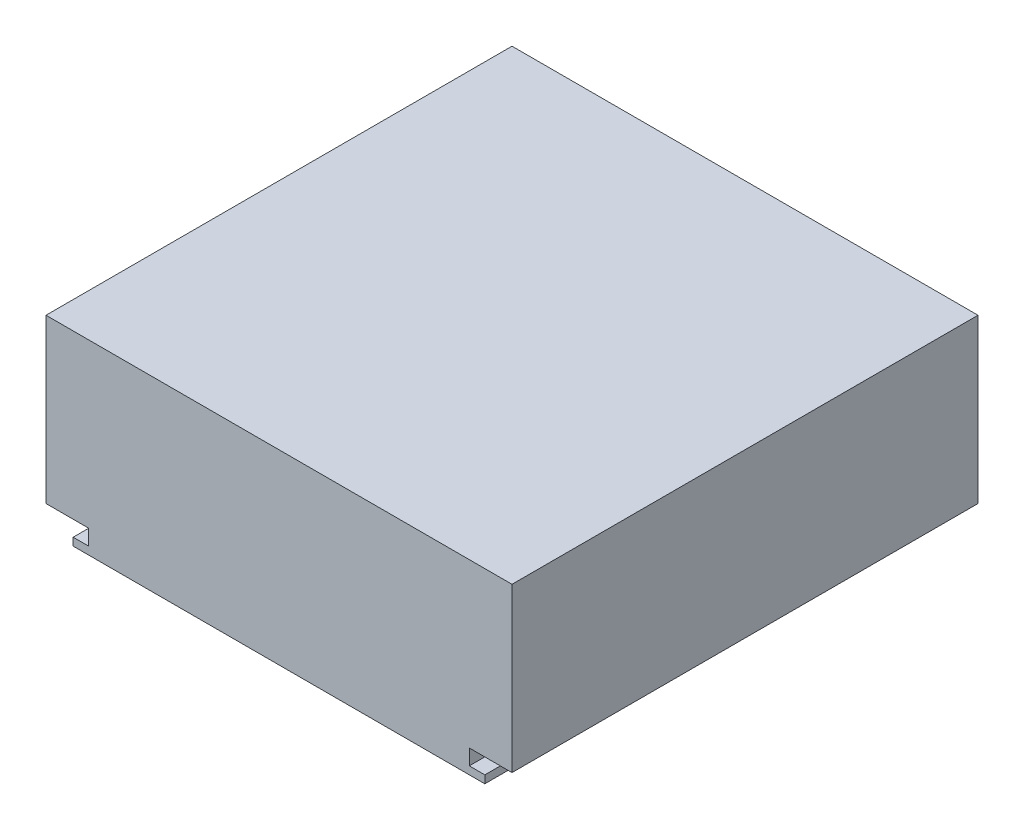
ISO-10303-21;
HEADER;
FILE_DESCRIPTION(('STEP AP214'),'2;1');
FILE_NAME('part.step','',(''),(''),'','','');
FILE_SCHEMA(('AUTOMOTIVE_DESIGN { 1 0 10303 214 1 1 1 1 }'));
ENDSEC;
DATA;
#1=APPLICATION_CONTEXT('core data for automotive mechanical design processes');
#2=APPLICATION_PROTOCOL_DEFINITION('international standard','automotive_design',2000,#1);
#3=PRODUCT_CONTEXT('',#1,'mechanical');
#4=PRODUCT('Part','Part','',(#3));
#5=PRODUCT_RELATED_PRODUCT_CATEGORY('part','',(#4));
#6=PRODUCT_DEFINITION_FORMATION('','',#4);
#7=PRODUCT_DEFINITION_CONTEXT('part definition',#1,'design');
#8=PRODUCT_DEFINITION('design','',#6,#7);
#9=PRODUCT_DEFINITION_SHAPE('','',#8);
#10=(LENGTH_UNIT() NAMED_UNIT(*) SI_UNIT(.MILLI.,.METRE.));
#11=(NAMED_UNIT(*) PLANE_ANGLE_UNIT() SI_UNIT($,.RADIAN.));
#12=(NAMED_UNIT(*) SI_UNIT($,.STERADIAN.) SOLID_ANGLE_UNIT());
#13=UNCERTAINTY_MEASURE_WITH_UNIT(LENGTH_MEASURE(1.E-05),#10,'distance_accuracy_value','');
#14=(GEOMETRIC_REPRESENTATION_CONTEXT(3) GLOBAL_UNCERTAINTY_ASSIGNED_CONTEXT((#13)) GLOBAL_UNIT_ASSIGNED_CONTEXT((#10,
#11,#12)) REPRESENTATION_CONTEXT('',''));
#15=CARTESIAN_POINT('',(0.,0.,0.));
#16=DIRECTION('',(0.,0.,1.));
#17=DIRECTION('',(1.,0.,0.));
#18=AXIS2_PLACEMENT_3D('',#15,#16,#17);
#19=CARTESIAN_POINT('',(0.,0.,-30.));
#20=DIRECTION('',(0.,0.,1.));
#21=DIRECTION('',(1.,0.,0.));
#22=AXIS2_PLACEMENT_3D('',#19,#20,#21);
#23=PLANE('',#22);
#24=DIRECTION('',(0.,-1.,0.));
#25=VECTOR('',#24,1.);
#26=CARTESIAN_POINT('',(7.175,24.,-30.));
#27=LINE('',#26,#25);
#28=CARTESIAN_POINT('',(7.175,24.,-30.));
#29=VERTEX_POINT('',#28);
#30=CARTESIAN_POINT('',(7.175,0.,-30.));
#31=VERTEX_POINT('',#30);
#32=EDGE_CURVE('E165',#29,#31,#27,.T.);
#33=ORIENTED_EDGE('',*,*,#32,.F.);
#34=DIRECTION('',(-1.,0.,0.));
#35=VECTOR('',#34,1.);
#36=CARTESIAN_POINT('',(-30.,24.,-30.));
#37=LINE('',#36,#35);
#38=CARTESIAN_POINT('',(30.,24.,-30.));
#39=VERTEX_POINT('',#38);
#40=EDGE_CURVE('E199',#39,#29,#37,.T.);
#41=ORIENTED_EDGE('',*,*,#40,.F.);
#42=DIRECTION('',(0.,1.,0.));
#43=VECTOR('',#42,1.);
#44=CARTESIAN_POINT('',(30.,24.,-30.));
#45=LINE('',#44,#43);
#46=CARTESIAN_POINT('',(30.,3.00000000000001,-30.));
#47=VERTEX_POINT('',#46);
#48=EDGE_CURVE('E260',#47,#39,#45,.T.);
#49=ORIENTED_EDGE('',*,*,#48,.F.);
#50=DIRECTION('',(1.,0.,0.));
#51=VECTOR('',#50,1.);
#52=CARTESIAN_POINT('',(30.,3.00000000000001,-30.));
#53=LINE('',#52,#51);
#54=CARTESIAN_POINT('',(24.5,3.00000000000001,-30.));
#55=VERTEX_POINT('',#54);
#56=EDGE_CURVE('E257',#55,#47,#53,.T.);
#57=ORIENTED_EDGE('',*,*,#56,.F.);
#58=DIRECTION('',(0.,1.,0.));
#59=VECTOR('',#58,1.);
#60=CARTESIAN_POINT('',(24.5,3.00000000000001,-30.));
#61=LINE('',#60,#59);
#62=CARTESIAN_POINT('',(24.5,1.00000000000001,-30.));
#63=VERTEX_POINT('',#62);
#64=EDGE_CURVE('E254',#63,#55,#61,.T.);
#65=ORIENTED_EDGE('',*,*,#64,.F.);
#66=DIRECTION('',(-1.,0.,0.));
#67=VECTOR('',#66,1.);
#68=CARTESIAN_POINT('',(26.5,1.00000000000001,-30.));
#69=LINE('',#68,#67);
#70=CARTESIAN_POINT('',(26.5,1.00000000000001,-30.));
#71=VERTEX_POINT('',#70);
#72=EDGE_CURVE('E251',#71,#63,#69,.T.);
#73=ORIENTED_EDGE('',*,*,#72,.F.);
#74=DIRECTION('',(0.,1.,0.));
#75=VECTOR('',#74,1.);
#76=CARTESIAN_POINT('',(26.5,1.00000000000001,-30.));
#77=LINE('',#76,#75);
#78=CARTESIAN_POINT('',(26.5,0.,-30.));
#79=VERTEX_POINT('',#78);
#80=EDGE_CURVE('E248',#79,#71,#77,.T.);
#81=ORIENTED_EDGE('',*,*,#80,.F.);
#82=DIRECTION('',(1.,0.,0.));
#83=VECTOR('',#82,1.);
#84=CARTESIAN_POINT('',(-26.5,0.,-30.));
#85=LINE('',#84,#83);
#86=EDGE_CURVE('E244',#31,#79,#85,.T.);
#87=ORIENTED_EDGE('',*,*,#86,.F.);
#88=EDGE_LOOP('',(#33,#41,#49,#57,#65,#73,#81,#87));
#89=FACE_BOUND('',#88,.T.);
#90=ADVANCED_FACE('F39',(#89),#23,.F.);
#91=CARTESIAN_POINT('',(-30.,24.,30.));
#92=DIRECTION('',(1.,0.,0.));
#93=DIRECTION('',(0.,0.,-1.));
#94=AXIS2_PLACEMENT_3D('',#91,#92,#93);
#95=PLANE('',#94);
#96=DIRECTION('',(0.,-1.,0.));
#97=VECTOR('',#96,1.);
#98=CARTESIAN_POINT('',(-30.,24.,-30.));
#99=LINE('',#98,#97);
#100=CARTESIAN_POINT('',(-30.,24.,-30.));
#101=VERTEX_POINT('',#100);
#102=CARTESIAN_POINT('',(-30.,3.,-30.));
#103=VERTEX_POINT('',#102);
#104=EDGE_CURVE('E183',#101,#103,#99,.T.);
#105=ORIENTED_EDGE('',*,*,#104,.T.);
#106=DIRECTION('',(0.,0.,-1.));
#107=VECTOR('',#106,1.);
#108=CARTESIAN_POINT('',(-30.,3.,30.));
#109=LINE('',#108,#107);
#110=CARTESIAN_POINT('',(-30.,3.,30.));
#111=VERTEX_POINT('',#110);
#112=EDGE_CURVE('E11',#111,#103,#109,.T.);
#113=ORIENTED_EDGE('',*,*,#112,.F.);
#114=DIRECTION('',(0.,-1.,0.));
#115=VECTOR('',#114,1.);
#116=CARTESIAN_POINT('',(-30.,24.,30.));
#117=LINE('',#116,#115);
#118=CARTESIAN_POINT('',(-30.,24.,30.));
#119=VERTEX_POINT('',#118);
#120=EDGE_CURVE('E194',#119,#111,#117,.T.);
#121=ORIENTED_EDGE('',*,*,#120,.F.);
#122=DIRECTION('',(0.,0.,-1.));
#123=VECTOR('',#122,1.);
#124=CARTESIAN_POINT('',(-30.,24.,30.));
#125=LINE('',#124,#123);
#126=EDGE_CURVE('E231',#119,#101,#125,.T.);
#127=ORIENTED_EDGE('',*,*,#126,.T.);
#128=EDGE_LOOP('',(#105,#113,#121,#127));
#129=FACE_BOUND('',#128,.T.);
#130=ADVANCED_FACE('F41',(#129),#95,.F.);
#131=CARTESIAN_POINT('',(-30.,3.,30.));
#132=DIRECTION('',(0.,1.,0.));
#133=DIRECTION('',(0.,0.,1.));
#134=AXIS2_PLACEMENT_3D('',#131,#132,#133);
#135=PLANE('',#134);
#136=DIRECTION('',(1.,0.,0.));
#137=VECTOR('',#136,1.);
#138=CARTESIAN_POINT('',(-30.,3.,-30.));
#139=LINE('',#138,#137);
#140=CARTESIAN_POINT('',(-24.5,3.,-30.));
#141=VERTEX_POINT('',#140);
#142=EDGE_CURVE('E188',#103,#141,#139,.T.);
#143=ORIENTED_EDGE('',*,*,#142,.T.);
#144=DIRECTION('',(0.,0.,-1.));
#145=VECTOR('',#144,1.);
#146=CARTESIAN_POINT('',(-24.5,3.,30.));
#147=LINE('',#146,#145);
#148=CARTESIAN_POINT('',(-24.5,3.,30.));
#149=VERTEX_POINT('',#148);
#150=EDGE_CURVE('E48',#149,#141,#147,.T.);
#151=ORIENTED_EDGE('',*,*,#150,.F.);
#152=DIRECTION('',(1.,0.,0.));
#153=VECTOR('',#152,1.);
#154=CARTESIAN_POINT('',(-30.,3.,30.));
#155=LINE('',#154,#153);
#156=EDGE_CURVE('E198',#111,#149,#155,.T.);
#157=ORIENTED_EDGE('',*,*,#156,.F.);
#158=ORIENTED_EDGE('',*,*,#112,.T.);
#159=EDGE_LOOP('',(#143,#151,#157,#158));
#160=FACE_BOUND('',#159,.T.);
#161=ADVANCED_FACE('F330',(#160),#135,.F.);
#162=CARTESIAN_POINT('',(-24.5,3.,30.));
#163=DIRECTION('',(1.,0.,0.));
#164=DIRECTION('',(0.,0.,-1.));
#165=AXIS2_PLACEMENT_3D('',#162,#163,#164);
#166=PLANE('',#165);
#167=DIRECTION('',(0.,-1.,0.));
#168=VECTOR('',#167,1.);
#169=CARTESIAN_POINT('',(-24.5,3.,-30.));
#170=LINE('',#169,#168);
#171=CARTESIAN_POINT('',(-24.5,1.,-30.));
#172=VERTEX_POINT('',#171);
#173=EDGE_CURVE('E235',#141,#172,#170,.T.);
#174=ORIENTED_EDGE('',*,*,#173,.T.);
#175=DIRECTION('',(0.,0.,-1.));
#176=VECTOR('',#175,1.);
#177=CARTESIAN_POINT('',(-24.5,1.,30.));
#178=LINE('',#177,#176);
#179=CARTESIAN_POINT('',(-24.5,1.,30.));
#180=VERTEX_POINT('',#179);
#181=EDGE_CURVE('E301',#180,#172,#178,.T.);
#182=ORIENTED_EDGE('',*,*,#181,.F.);
#183=DIRECTION('',(0.,-1.,0.));
#184=VECTOR('',#183,1.);
#185=CARTESIAN_POINT('',(-24.5,3.,30.));
#186=LINE('',#185,#184);
#187=EDGE_CURVE('E202',#149,#180,#186,.T.);
#188=ORIENTED_EDGE('',*,*,#187,.F.);
#189=ORIENTED_EDGE('',*,*,#150,.T.);
#190=EDGE_LOOP('',(#174,#182,#188,#189));
#191=FACE_BOUND('',#190,.T.);
#192=ADVANCED_FACE('F310',(#191),#166,.F.);
#193=CARTESIAN_POINT('',(-26.5,1.,30.));
#194=DIRECTION('',(0.,-1.,0.));
#195=DIRECTION('',(0.,0.,-1.));
#196=AXIS2_PLACEMENT_3D('',#193,#194,#195);
#197=PLANE('',#196);
#198=DIRECTION('',(-1.,0.,0.));
#199=VECTOR('',#198,1.);
#200=CARTESIAN_POINT('',(-26.5,1.,-30.));
#201=LINE('',#200,#199);
#202=CARTESIAN_POINT('',(-26.5,1.,-30.));
#203=VERTEX_POINT('',#202);
#204=EDGE_CURVE('E238',#172,#203,#201,.T.);
#205=ORIENTED_EDGE('',*,*,#204,.T.);
#206=DIRECTION('',(0.,0.,-1.));
#207=VECTOR('',#206,1.);
#208=CARTESIAN_POINT('',(-26.5,1.,30.));
#209=LINE('',#208,#207);
#210=CARTESIAN_POINT('',(-26.5,1.,30.));
#211=VERTEX_POINT('',#210);
#212=EDGE_CURVE('E297',#211,#203,#209,.T.);
#213=ORIENTED_EDGE('',*,*,#212,.F.);
#214=DIRECTION('',(-1.,0.,0.));
#215=VECTOR('',#214,1.);
#216=CARTESIAN_POINT('',(-26.5,1.,30.));
#217=LINE('',#216,#215);
#218=EDGE_CURVE('E205',#180,#211,#217,.T.);
#219=ORIENTED_EDGE('',*,*,#218,.F.);
#220=ORIENTED_EDGE('',*,*,#181,.T.);
#221=EDGE_LOOP('',(#205,#213,#219,#220));
#222=FACE_BOUND('',#221,.T.);
#223=ADVANCED_FACE('F318',(#222),#197,.F.);
#224=CARTESIAN_POINT('',(-26.5,1.,30.));
#225=DIRECTION('',(1.,0.,0.));
#226=DIRECTION('',(0.,0.,-1.));
#227=AXIS2_PLACEMENT_3D('',#224,#225,#226);
#228=PLANE('',#227);
#229=DIRECTION('',(0.,-1.,0.));
#230=VECTOR('',#229,1.);
#231=CARTESIAN_POINT('',(-26.5,1.,-30.));
#232=LINE('',#231,#230);
#233=CARTESIAN_POINT('',(-26.5,0.,-30.));
#234=VERTEX_POINT('',#233);
#235=EDGE_CURVE('E241',#203,#234,#232,.T.);
#236=ORIENTED_EDGE('',*,*,#235,.T.);
#237=DIRECTION('',(0.,0.,-1.));
#238=VECTOR('',#237,1.);
#239=CARTESIAN_POINT('',(-26.5,0.,30.));
#240=LINE('',#239,#238);
#241=CARTESIAN_POINT('',(-26.5,0.,30.));
#242=VERTEX_POINT('',#241);
#243=EDGE_CURVE('E293',#242,#234,#240,.T.);
#244=ORIENTED_EDGE('',*,*,#243,.F.);
#245=DIRECTION('',(0.,-1.,0.));
#246=VECTOR('',#245,1.);
#247=CARTESIAN_POINT('',(-26.5,1.,30.));
#248=LINE('',#247,#246);
#249=EDGE_CURVE('E208',#211,#242,#248,.T.);
#250=ORIENTED_EDGE('',*,*,#249,.F.);
#251=ORIENTED_EDGE('',*,*,#212,.T.);
#252=EDGE_LOOP('',(#236,#244,#250,#251));
#253=FACE_BOUND('',#252,.T.);
#254=ADVANCED_FACE('F322',(#253),#228,.F.);
#255=CARTESIAN_POINT('',(-26.5,0.,30.));
#256=DIRECTION('',(0.,1.,0.));
#257=DIRECTION('',(-1.,0.,0.));
#258=AXIS2_PLACEMENT_3D('',#255,#256,#257);
#259=PLANE('',#258);
#260=CARTESIAN_POINT('',(2.175,0.,-30.));
#261=VERTEX_POINT('',#260);
#262=EDGE_CURVE('E245',#234,#261,#85,.T.);
#263=ORIENTED_EDGE('',*,*,#262,.T.);
#264=DIRECTION('',(-1.,0.,0.));
#265=VECTOR('',#264,1.);
#266=CARTESIAN_POINT('',(7.175,0.,-30.));
#267=LINE('',#266,#265);
#268=EDGE_CURVE('E190',#31,#261,#267,.T.);
#269=ORIENTED_EDGE('',*,*,#268,.F.);
#270=ORIENTED_EDGE('',*,*,#86,.T.);
#271=DIRECTION('',(0.,0.,-1.));
#272=VECTOR('',#271,1.);
#273=CARTESIAN_POINT('',(26.5,0.,30.));
#274=LINE('',#273,#272);
#275=CARTESIAN_POINT('',(26.5,0.,30.));
#276=VERTEX_POINT('',#275);
#277=EDGE_CURVE('E289',#276,#79,#274,.T.);
#278=ORIENTED_EDGE('',*,*,#277,.F.);
#279=DIRECTION('',(1.,0.,0.));
#280=VECTOR('',#279,1.);
#281=CARTESIAN_POINT('',(-26.5,0.,30.));
#282=LINE('',#281,#280);
#283=EDGE_CURVE('E211',#242,#276,#282,.T.);
#284=ORIENTED_EDGE('',*,*,#283,.F.);
#285=ORIENTED_EDGE('',*,*,#243,.T.);
#286=EDGE_LOOP('',(#263,#269,#270,#278,#284,#285));
#287=FACE_BOUND('',#286,.T.);
#288=ADVANCED_FACE('F340',(#287),#259,.F.);
#289=CARTESIAN_POINT('',(26.5,1.00000000000001,30.));
#290=DIRECTION('',(-1.,0.,0.));
#291=DIRECTION('',(0.,0.,1.));
#292=AXIS2_PLACEMENT_3D('',#289,#290,#291);
#293=PLANE('',#292);
#294=ORIENTED_EDGE('',*,*,#80,.T.);
#295=DIRECTION('',(0.,0.,-1.));
#296=VECTOR('',#295,1.);
#297=CARTESIAN_POINT('',(26.5,1.00000000000001,30.));
#298=LINE('',#297,#296);
#299=CARTESIAN_POINT('',(26.5,1.00000000000001,30.));
#300=VERTEX_POINT('',#299);
#301=EDGE_CURVE('E285',#300,#71,#298,.T.);
#302=ORIENTED_EDGE('',*,*,#301,.F.);
#303=DIRECTION('',(0.,1.,0.));
#304=VECTOR('',#303,1.);
#305=CARTESIAN_POINT('',(26.5,1.00000000000001,30.));
#306=LINE('',#305,#304);
#307=EDGE_CURVE('E214',#276,#300,#306,.T.);
#308=ORIENTED_EDGE('',*,*,#307,.F.);
#309=ORIENTED_EDGE('',*,*,#277,.T.);
#310=EDGE_LOOP('',(#294,#302,#308,#309));
#311=FACE_BOUND('',#310,.T.);
#312=ADVANCED_FACE('F346',(#311),#293,.F.);
#313=CARTESIAN_POINT('',(26.5,1.00000000000001,30.));
#314=DIRECTION('',(0.,-1.,0.));
#315=DIRECTION('',(1.,0.,0.));
#316=AXIS2_PLACEMENT_3D('',#313,#314,#315);
#317=PLANE('',#316);
#318=ORIENTED_EDGE('',*,*,#72,.T.);
#319=DIRECTION('',(0.,0.,-1.));
#320=VECTOR('',#319,1.);
#321=CARTESIAN_POINT('',(24.5,1.00000000000001,30.));
#322=LINE('',#321,#320);
#323=CARTESIAN_POINT('',(24.5,1.00000000000001,30.));
#324=VERTEX_POINT('',#323);
#325=EDGE_CURVE('E281',#324,#63,#322,.T.);
#326=ORIENTED_EDGE('',*,*,#325,.F.);
#327=DIRECTION('',(-1.,0.,0.));
#328=VECTOR('',#327,1.);
#329=CARTESIAN_POINT('',(26.5,1.00000000000001,30.));
#330=LINE('',#329,#328);
#331=EDGE_CURVE('E217',#300,#324,#330,.T.);
#332=ORIENTED_EDGE('',*,*,#331,.F.);
#333=ORIENTED_EDGE('',*,*,#301,.T.);
#334=EDGE_LOOP('',(#318,#326,#332,#333));
#335=FACE_BOUND('',#334,.T.);
#336=ADVANCED_FACE('F353',(#335),#317,.F.);
#337=CARTESIAN_POINT('',(24.5,3.00000000000001,30.));
#338=DIRECTION('',(-1.,0.,0.));
#339=DIRECTION('',(0.,0.,1.));
#340=AXIS2_PLACEMENT_3D('',#337,#338,#339);
#341=PLANE('',#340);
#342=ORIENTED_EDGE('',*,*,#64,.T.);
#343=DIRECTION('',(0.,0.,-1.));
#344=VECTOR('',#343,1.);
#345=CARTESIAN_POINT('',(24.5,3.00000000000001,30.));
#346=LINE('',#345,#344);
#347=CARTESIAN_POINT('',(24.5,3.00000000000001,30.));
#348=VERTEX_POINT('',#347);
#349=EDGE_CURVE('E277',#348,#55,#346,.T.);
#350=ORIENTED_EDGE('',*,*,#349,.F.);
#351=DIRECTION('',(0.,1.,0.));
#352=VECTOR('',#351,1.);
#353=CARTESIAN_POINT('',(24.5,3.00000000000001,30.));
#354=LINE('',#353,#352);
#355=EDGE_CURVE('E220',#324,#348,#354,.T.);
#356=ORIENTED_EDGE('',*,*,#355,.F.);
#357=ORIENTED_EDGE('',*,*,#325,.T.);
#358=EDGE_LOOP('',(#342,#350,#356,#357));
#359=FACE_BOUND('',#358,.T.);
#360=ADVANCED_FACE('F357',(#359),#341,.F.);
#361=CARTESIAN_POINT('',(30.,3.00000000000001,30.));
#362=DIRECTION('',(0.,1.,0.));
#363=DIRECTION('',(-1.,0.,0.));
#364=AXIS2_PLACEMENT_3D('',#361,#362,#363);
#365=PLANE('',#364);
#366=ORIENTED_EDGE('',*,*,#56,.T.);
#367=DIRECTION('',(0.,0.,-1.));
#368=VECTOR('',#367,1.);
#369=CARTESIAN_POINT('',(30.,3.00000000000001,30.));
#370=LINE('',#369,#368);
#371=CARTESIAN_POINT('',(30.,3.00000000000001,30.));
#372=VERTEX_POINT('',#371);
#373=EDGE_CURVE('E273',#372,#47,#370,.T.);
#374=ORIENTED_EDGE('',*,*,#373,.F.);
#375=DIRECTION('',(1.,0.,0.));
#376=VECTOR('',#375,1.);
#377=CARTESIAN_POINT('',(30.,3.00000000000001,30.));
#378=LINE('',#377,#376);
#379=EDGE_CURVE('E223',#348,#372,#378,.T.);
#380=ORIENTED_EDGE('',*,*,#379,.F.);
#381=ORIENTED_EDGE('',*,*,#349,.T.);
#382=EDGE_LOOP('',(#366,#374,#380,#381));
#383=FACE_BOUND('',#382,.T.);
#384=ADVANCED_FACE('F364',(#383),#365,.F.);
#385=CARTESIAN_POINT('',(30.,24.,30.));
#386=DIRECTION('',(-1.,0.,0.));
#387=DIRECTION('',(0.,0.,1.));
#388=AXIS2_PLACEMENT_3D('',#385,#386,#387);
#389=PLANE('',#388);
#390=ORIENTED_EDGE('',*,*,#48,.T.);
#391=DIRECTION('',(0.,0.,-1.));
#392=VECTOR('',#391,1.);
#393=CARTESIAN_POINT('',(30.,24.,30.));
#394=LINE('',#393,#392);
#395=CARTESIAN_POINT('',(30.,24.,30.));
#396=VERTEX_POINT('',#395);
#397=EDGE_CURVE('E269',#396,#39,#394,.T.);
#398=ORIENTED_EDGE('',*,*,#397,.F.);
#399=DIRECTION('',(0.,1.,0.));
#400=VECTOR('',#399,1.);
#401=CARTESIAN_POINT('',(30.,24.,30.));
#402=LINE('',#401,#400);
#403=EDGE_CURVE('E226',#372,#396,#402,.T.);
#404=ORIENTED_EDGE('',*,*,#403,.F.);
#405=ORIENTED_EDGE('',*,*,#373,.T.);
#406=EDGE_LOOP('',(#390,#398,#404,#405));
#407=FACE_BOUND('',#406,.T.);
#408=ADVANCED_FACE('F367',(#407),#389,.F.);
#409=CARTESIAN_POINT('',(-30.,24.,30.));
#410=DIRECTION('',(0.,-1.,0.));
#411=DIRECTION('',(1.,0.,0.));
#412=AXIS2_PLACEMENT_3D('',#409,#410,#411);
#413=PLANE('',#412);
#414=ORIENTED_EDGE('',*,*,#40,.T.);
#415=DIRECTION('',(-1.,0.,0.));
#416=VECTOR('',#415,1.);
#417=CARTESIAN_POINT('',(7.175,24.,-30.));
#418=LINE('',#417,#416);
#419=CARTESIAN_POINT('',(2.175,24.,-30.));
#420=VERTEX_POINT('',#419);
#421=EDGE_CURVE('E161',#29,#420,#418,.T.);
#422=ORIENTED_EDGE('',*,*,#421,.T.);
#423=EDGE_CURVE('E60',#420,#101,#37,.T.);
#424=ORIENTED_EDGE('',*,*,#423,.T.);
#425=ORIENTED_EDGE('',*,*,#126,.F.);
#426=DIRECTION('',(-1.,0.,0.));
#427=VECTOR('',#426,1.);
#428=CARTESIAN_POINT('',(-30.,24.,30.));
#429=LINE('',#428,#427);
#430=EDGE_CURVE('E229',#396,#119,#429,.T.);
#431=ORIENTED_EDGE('',*,*,#430,.F.);
#432=ORIENTED_EDGE('',*,*,#397,.T.);
#433=EDGE_LOOP('',(#414,#422,#424,#425,#431,#432));
#434=FACE_BOUND('',#433,.T.);
#435=ADVANCED_FACE('F335',(#434),#413,.F.);
#436=CARTESIAN_POINT('',(0.,0.,30.));
#437=DIRECTION('',(0.,0.,1.));
#438=DIRECTION('',(1.,0.,0.));
#439=AXIS2_PLACEMENT_3D('',#436,#437,#438);
#440=PLANE('',#439);
#441=ORIENTED_EDGE('',*,*,#120,.T.);
#442=ORIENTED_EDGE('',*,*,#156,.T.);
#443=ORIENTED_EDGE('',*,*,#187,.T.);
#444=ORIENTED_EDGE('',*,*,#218,.T.);
#445=ORIENTED_EDGE('',*,*,#249,.T.);
#446=ORIENTED_EDGE('',*,*,#283,.T.);
#447=ORIENTED_EDGE('',*,*,#307,.T.);
#448=ORIENTED_EDGE('',*,*,#331,.T.);
#449=ORIENTED_EDGE('',*,*,#355,.T.);
#450=ORIENTED_EDGE('',*,*,#379,.T.);
#451=ORIENTED_EDGE('',*,*,#403,.T.);
#452=ORIENTED_EDGE('',*,*,#430,.T.);
#453=EDGE_LOOP('',(#441,#442,#443,#444,#445,#446,#447,#448,#449,#450,#451,#452));
#454=FACE_BOUND('',#453,.T.);
#455=ADVANCED_FACE('F326',(#454),#440,.T.);
#456=ORIENTED_EDGE('',*,*,#423,.F.);
#457=DIRECTION('',(0.,-1.,0.));
#458=VECTOR('',#457,1.);
#459=CARTESIAN_POINT('',(2.175,24.,-30.));
#460=LINE('',#459,#458);
#461=EDGE_CURVE('E55',#420,#261,#460,.T.);
#462=ORIENTED_EDGE('',*,*,#461,.T.);
#463=ORIENTED_EDGE('',*,*,#262,.F.);
#464=ORIENTED_EDGE('',*,*,#235,.F.);
#465=ORIENTED_EDGE('',*,*,#204,.F.);
#466=ORIENTED_EDGE('',*,*,#173,.F.);
#467=ORIENTED_EDGE('',*,*,#142,.F.);
#468=ORIENTED_EDGE('',*,*,#104,.F.);
#469=EDGE_LOOP('',(#456,#462,#463,#464,#465,#466,#467,#468));
#470=FACE_BOUND('',#469,.T.);
#471=ADVANCED_FACE('F314',(#470),#23,.F.);
#472=CARTESIAN_POINT('',(7.175,5.00000000000001,-35.));
#473=DIRECTION('',(-1.,0.,0.));
#474=DIRECTION('',(0.,0.,1.));
#475=AXIS2_PLACEMENT_3D('',#472,#473,#474);
#476=PLANE('',#475);
#477=CARTESIAN_POINT('',(7.175,5.00000000000001,-35.));
#478=DIRECTION('',(1.,0.,0.));
#479=DIRECTION('',(0.,0.,1.));
#480=AXIS2_PLACEMENT_3D('',#477,#478,#479);
#481=CIRCLE('',#480,3.05);
#482=CARTESIAN_POINT('',(7.175,2.12401493645718,-36.0154850635428));
#483=VERTEX_POINT('',#482);
#484=CARTESIAN_POINT('',(7.175,6.22468943443559,-37.7933198508552));
#485=VERTEX_POINT('',#484);
#486=EDGE_CURVE('E166',#483,#485,#481,.T.);
#487=ORIENTED_EDGE('',*,*,#486,.T.);
#488=DIRECTION('',(0.,0.915842574050893,0.401537519487077));
#489=VECTOR('',#488,1.);
#490=CARTESIAN_POINT('',(7.175,6.22468943443559,-37.7933198508552));
#491=LINE('',#490,#489);
#492=EDGE_CURVE('E154',#485,#29,#491,.T.);
#493=ORIENTED_EDGE('',*,*,#492,.T.);
#494=ORIENTED_EDGE('',*,*,#32,.T.);
#495=DIRECTION('',(0.,0.332945922473057,-0.942945922473057));
#496=VECTOR('',#495,1.);
#497=CARTESIAN_POINT('',(7.175,0.,-30.));
#498=LINE('',#497,#496);
#499=EDGE_CURVE('E172',#31,#483,#498,.T.);
#500=ORIENTED_EDGE('',*,*,#499,.T.);
#501=EDGE_LOOP('',(#487,#493,#494,#500));
#502=FACE_BOUND('',#501,.T.);
#503=CARTESIAN_POINT('',(7.175,5.00000000000001,-35.));
#504=DIRECTION('',(1.,0.,0.));
#505=DIRECTION('',(0.,0.,-1.));
#506=AXIS2_PLACEMENT_3D('',#503,#504,#505);
#507=CIRCLE('',#506,1.55);
#508=CARTESIAN_POINT('',(7.175,5.00000000000001,-36.55));
#509=VERTEX_POINT('',#508);
#510=EDGE_CURVE('E378',#509,#509,#507,.T.);
#511=ORIENTED_EDGE('',*,*,#510,.F.);
#512=EDGE_LOOP('',(#511));
#513=FACE_BOUND('',#512,.T.);
#514=ADVANCED_FACE('F169',(#502,#513),#476,.F.);
#515=CARTESIAN_POINT('',(2.175,5.00000000000001,-35.));
#516=DIRECTION('',(-1.,0.,0.));
#517=DIRECTION('',(0.,0.,1.));
#518=AXIS2_PLACEMENT_3D('',#515,#516,#517);
#519=PLANE('',#518);
#520=CARTESIAN_POINT('',(2.175,5.00000000000001,-35.));
#521=DIRECTION('',(1.,0.,0.));
#522=DIRECTION('',(0.,0.,1.));
#523=AXIS2_PLACEMENT_3D('',#520,#521,#522);
#524=CIRCLE('',#523,3.05);
#525=CARTESIAN_POINT('',(2.175,2.12401493645718,-36.0154850635428));
#526=VERTEX_POINT('',#525);
#527=CARTESIAN_POINT('',(2.175,6.22468943443559,-37.7933198508552));
#528=VERTEX_POINT('',#527);
#529=EDGE_CURVE('E181',#526,#528,#524,.T.);
#530=ORIENTED_EDGE('',*,*,#529,.F.);
#531=DIRECTION('',(0.,0.332945922473057,-0.942945922473057));
#532=VECTOR('',#531,1.);
#533=CARTESIAN_POINT('',(2.175,0.,-30.));
#534=LINE('',#533,#532);
#535=EDGE_CURVE('E177',#261,#526,#534,.T.);
#536=ORIENTED_EDGE('',*,*,#535,.F.);
#537=ORIENTED_EDGE('',*,*,#461,.F.);
#538=DIRECTION('',(0.,0.915842574050893,0.401537519487077));
#539=VECTOR('',#538,1.);
#540=CARTESIAN_POINT('',(2.175,6.22468943443559,-37.7933198508552));
#541=LINE('',#540,#539);
#542=EDGE_CURVE('E377',#528,#420,#541,.T.);
#543=ORIENTED_EDGE('',*,*,#542,.F.);
#544=EDGE_LOOP('',(#530,#536,#537,#543));
#545=FACE_BOUND('',#544,.T.);
#546=CARTESIAN_POINT('',(2.175,5.00000000000001,-35.));
#547=DIRECTION('',(1.,0.,0.));
#548=DIRECTION('',(0.,0.,-1.));
#549=AXIS2_PLACEMENT_3D('',#546,#547,#548);
#550=CIRCLE('',#549,1.55);
#551=CARTESIAN_POINT('',(2.175,5.00000000000001,-36.55));
#552=VERTEX_POINT('',#551);
#553=EDGE_CURVE('E397',#552,#552,#550,.T.);
#554=ORIENTED_EDGE('',*,*,#553,.T.);
#555=EDGE_LOOP('',(#554));
#556=FACE_BOUND('',#555,.T.);
#557=ADVANCED_FACE('F391',(#545,#556),#519,.T.);
#558=CARTESIAN_POINT('',(7.175,5.00000000000001,-35.));
#559=DIRECTION('',(-1.,0.,0.));
#560=DIRECTION('',(0.,0.,1.));
#561=AXIS2_PLACEMENT_3D('',#558,#559,#560);
#562=CYLINDRICAL_SURFACE('',#561,3.05);
#563=ORIENTED_EDGE('',*,*,#529,.T.);
#564=DIRECTION('',(-1.,0.,0.));
#565=VECTOR('',#564,1.);
#566=CARTESIAN_POINT('',(7.175,6.22468943443559,-37.7933198508552));
#567=LINE('',#566,#565);
#568=EDGE_CURVE('E159',#485,#528,#567,.T.);
#569=ORIENTED_EDGE('',*,*,#568,.F.);
#570=ORIENTED_EDGE('',*,*,#486,.F.);
#571=DIRECTION('',(-1.,0.,0.));
#572=VECTOR('',#571,1.);
#573=CARTESIAN_POINT('',(7.175,2.12401493645718,-36.0154850635428));
#574=LINE('',#573,#572);
#575=EDGE_CURVE('E372',#483,#526,#574,.T.);
#576=ORIENTED_EDGE('',*,*,#575,.T.);
#577=EDGE_LOOP('',(#563,#569,#570,#576));
#578=FACE_BOUND('',#577,.T.);
#579=ADVANCED_FACE('F179',(#578),#562,.T.);
#580=CARTESIAN_POINT('',(7.175,6.22468943443559,-37.7933198508552));
#581=DIRECTION('',(0.,-0.401537519487077,0.915842574050893));
#582=DIRECTION('',(0.,-0.915842574050893,-0.401537519487077));
#583=AXIS2_PLACEMENT_3D('',#580,#581,#582);
#584=PLANE('',#583);
#585=ORIENTED_EDGE('',*,*,#542,.T.);
#586=ORIENTED_EDGE('',*,*,#421,.F.);
#587=ORIENTED_EDGE('',*,*,#492,.F.);
#588=ORIENTED_EDGE('',*,*,#568,.T.);
#589=EDGE_LOOP('',(#585,#586,#587,#588));
#590=FACE_BOUND('',#589,.T.);
#591=ADVANCED_FACE('F157',(#590),#584,.F.);
#592=CARTESIAN_POINT('',(7.175,0.,-30.));
#593=DIRECTION('',(0.,0.942945922473057,0.332945922473057));
#594=DIRECTION('',(0.,-0.332945922473057,0.942945922473057));
#595=AXIS2_PLACEMENT_3D('',#592,#593,#594);
#596=PLANE('',#595);
#597=ORIENTED_EDGE('',*,*,#535,.T.);
#598=ORIENTED_EDGE('',*,*,#575,.F.);
#599=ORIENTED_EDGE('',*,*,#499,.F.);
#600=ORIENTED_EDGE('',*,*,#268,.T.);
#601=EDGE_LOOP('',(#597,#598,#599,#600));
#602=FACE_BOUND('',#601,.T.);
#603=ADVANCED_FACE('F389',(#602),#596,.F.);
#604=CARTESIAN_POINT('',(7.175,5.00000000000001,-35.));
#605=DIRECTION('',(-1.,0.,0.));
#606=DIRECTION('',(0.,0.,1.));
#607=AXIS2_PLACEMENT_3D('',#604,#605,#606);
#608=CYLINDRICAL_SURFACE('',#607,1.55);
#609=ORIENTED_EDGE('',*,*,#510,.T.);
#610=EDGE_LOOP('',(#609));
#611=FACE_BOUND('',#610,.T.);
#612=ORIENTED_EDGE('',*,*,#553,.F.);
#613=EDGE_LOOP('',(#612));
#614=FACE_BOUND('',#613,.T.);
#615=ADVANCED_FACE('F406',(#611,#614),#608,.F.);
#616=CLOSED_SHELL('',(#90,#130,#161,#192,#223,#254,#288,#312,#336,#360,#384,#408,#435,#455,#471,
#514,#557,#579,#591,#603,#615));
#617=MANIFOLD_SOLID_BREP('B2',#616);
#618=ADVANCED_BREP_SHAPE_REPRESENTATION('',(#18,#617),#14);
#619=SHAPE_DEFINITION_REPRESENTATION(#9,#618);
ENDSEC;
END-ISO-10303-21;
